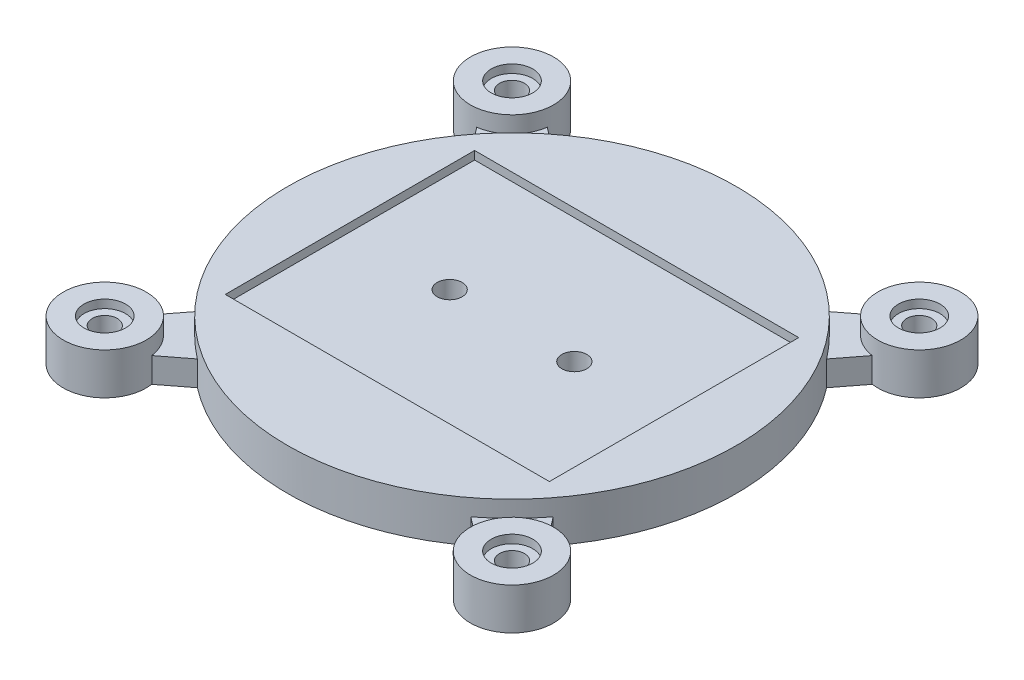
ISO-10303-21;
HEADER;
FILE_DESCRIPTION(('STEP AP214'),'2;1');
FILE_NAME('part.step','',(''),(''),'','','');
FILE_SCHEMA(('AUTOMOTIVE_DESIGN { 1 0 10303 214 1 1 1 1 }'));
ENDSEC;
DATA;
#1=APPLICATION_CONTEXT('core data for automotive mechanical design processes');
#2=APPLICATION_PROTOCOL_DEFINITION('international standard','automotive_design',2000,#1);
#3=PRODUCT_CONTEXT('',#1,'mechanical');
#4=PRODUCT('Part','Part','',(#3));
#5=PRODUCT_RELATED_PRODUCT_CATEGORY('part','',(#4));
#6=PRODUCT_DEFINITION_FORMATION('','',#4);
#7=PRODUCT_DEFINITION_CONTEXT('part definition',#1,'design');
#8=PRODUCT_DEFINITION('design','',#6,#7);
#9=PRODUCT_DEFINITION_SHAPE('','',#8);
#10=(LENGTH_UNIT() NAMED_UNIT(*) SI_UNIT(.MILLI.,.METRE.));
#11=(NAMED_UNIT(*) PLANE_ANGLE_UNIT() SI_UNIT($,.RADIAN.));
#12=(NAMED_UNIT(*) SI_UNIT($,.STERADIAN.) SOLID_ANGLE_UNIT());
#13=UNCERTAINTY_MEASURE_WITH_UNIT(LENGTH_MEASURE(1.E-05),#10,'distance_accuracy_value','');
#14=(GEOMETRIC_REPRESENTATION_CONTEXT(3) GLOBAL_UNCERTAINTY_ASSIGNED_CONTEXT((#13)) GLOBAL_UNIT_ASSIGNED_CONTEXT((#10,
#11,#12)) REPRESENTATION_CONTEXT('',''));
#15=CARTESIAN_POINT('',(0.,0.,0.));
#16=DIRECTION('',(0.,0.,1.));
#17=DIRECTION('',(1.,0.,0.));
#18=AXIS2_PLACEMENT_3D('',#15,#16,#17);
#19=CARTESIAN_POINT('',(0.,5.,0.));
#20=DIRECTION('',(0.,-1.,0.));
#21=DIRECTION('',(0.,0.,-1.));
#22=AXIS2_PLACEMENT_3D('',#19,#20,#21);
#23=CYLINDRICAL_SURFACE('',#22,27.);
#24=CARTESIAN_POINT('',(0.,5.,0.));
#25=DIRECTION('',(0.,1.,0.));
#26=DIRECTION('',(0.,0.,1.));
#27=AXIS2_PLACEMENT_3D('',#24,#25,#26);
#28=CIRCLE('',#27,27.);
#29=CARTESIAN_POINT('',(0.,5.,27.));
#30=VERTEX_POINT('',#29);
#31=EDGE_CURVE('E11',#30,#30,#28,.T.);
#32=ORIENTED_EDGE('',*,*,#31,.F.);
#33=EDGE_LOOP('',(#32));
#34=FACE_BOUND('',#33,.T.);
#35=CARTESIAN_POINT('',(0.,0.,0.));
#36=DIRECTION('',(0.,1.,0.));
#37=DIRECTION('',(0.,0.,1.));
#38=AXIS2_PLACEMENT_3D('',#35,#36,#37);
#39=CIRCLE('',#38,27.);
#40=CARTESIAN_POINT('',(21.4056687517955,0.,16.4559212834895));
#41=VERTEX_POINT('',#40);
#42=CARTESIAN_POINT('',(21.4056687517952,0.,-16.45592128349));
#43=VERTEX_POINT('',#42);
#44=EDGE_CURVE('E420',#41,#43,#39,.T.);
#45=ORIENTED_EDGE('',*,*,#44,.T.);
#46=DIRECTION('',(0.,-1.,0.));
#47=VECTOR('',#46,1.);
#48=CARTESIAN_POINT('',(21.4056687517952,3.,-16.45592128349));
#49=LINE('',#48,#47);
#50=CARTESIAN_POINT('',(21.4056687517952,3.,-16.45592128349));
#51=VERTEX_POINT('',#50);
#52=EDGE_CURVE('E61',#51,#43,#49,.T.);
#53=ORIENTED_EDGE('',*,*,#52,.F.);
#54=CARTESIAN_POINT('',(0.,3.,0.));
#55=DIRECTION('',(0.,1.,0.));
#56=DIRECTION('',(-1.,0.,0.));
#57=AXIS2_PLACEMENT_3D('',#54,#55,#56);
#58=CIRCLE('',#57,27.);
#59=CARTESIAN_POINT('',(16.4559212834893,3.,-21.4056687517957));
#60=VERTEX_POINT('',#59);
#61=EDGE_CURVE('E56',#51,#60,#58,.T.);
#62=ORIENTED_EDGE('',*,*,#61,.T.);
#63=DIRECTION('',(0.,-1.,0.));
#64=VECTOR('',#63,1.);
#65=CARTESIAN_POINT('',(16.4559212834893,3.,-21.4056687517957));
#66=LINE('',#65,#64);
#67=CARTESIAN_POINT('',(16.4559212834893,0.,-21.4056687517957));
#68=VERTEX_POINT('',#67);
#69=EDGE_CURVE('E203',#60,#68,#66,.T.);
#70=ORIENTED_EDGE('',*,*,#69,.T.);
#71=CARTESIAN_POINT('',(-16.4559212834898,0.,-21.4056687517954));
#72=VERTEX_POINT('',#71);
#73=EDGE_CURVE('E417',#68,#72,#39,.T.);
#74=ORIENTED_EDGE('',*,*,#73,.T.);
#75=DIRECTION('',(0.,-1.,0.));
#76=VECTOR('',#75,1.);
#77=CARTESIAN_POINT('',(-16.4559212834898,3.,-21.4056687517954));
#78=LINE('',#77,#76);
#79=CARTESIAN_POINT('',(-16.4559212834898,3.,-21.4056687517954));
#80=VERTEX_POINT('',#79);
#81=EDGE_CURVE('E414',#80,#72,#78,.T.);
#82=ORIENTED_EDGE('',*,*,#81,.F.);
#83=CARTESIAN_POINT('',(0.,3.,0.));
#84=DIRECTION('',(0.,1.,0.));
#85=DIRECTION('',(0.,0.,1.));
#86=AXIS2_PLACEMENT_3D('',#83,#84,#85);
#87=CIRCLE('',#86,27.);
#88=CARTESIAN_POINT('',(-21.4056687517956,3.,-16.4559212834895));
#89=VERTEX_POINT('',#88);
#90=EDGE_CURVE('E381',#80,#89,#87,.T.);
#91=ORIENTED_EDGE('',*,*,#90,.T.);
#92=DIRECTION('',(0.,-1.,0.));
#93=VECTOR('',#92,1.);
#94=CARTESIAN_POINT('',(-21.4056687517955,3.,-16.4559212834895));
#95=LINE('',#94,#93);
#96=CARTESIAN_POINT('',(-21.4056687517955,0.,-16.4559212834895));
#97=VERTEX_POINT('',#96);
#98=EDGE_CURVE('E397',#89,#97,#95,.T.);
#99=ORIENTED_EDGE('',*,*,#98,.T.);
#100=CARTESIAN_POINT('',(-21.4056687517953,0.,16.4559212834898));
#101=VERTEX_POINT('',#100);
#102=EDGE_CURVE('E44',#97,#101,#39,.T.);
#103=ORIENTED_EDGE('',*,*,#102,.T.);
#104=DIRECTION('',(0.,-1.,0.));
#105=VECTOR('',#104,1.);
#106=CARTESIAN_POINT('',(-21.4056687517953,3.,16.4559212834898));
#107=LINE('',#106,#105);
#108=CARTESIAN_POINT('',(-21.4056687517953,3.,16.4559212834898));
#109=VERTEX_POINT('',#108);
#110=EDGE_CURVE('E292',#109,#101,#107,.T.);
#111=ORIENTED_EDGE('',*,*,#110,.F.);
#112=CARTESIAN_POINT('',(0.,3.,0.));
#113=DIRECTION('',(0.,1.,0.));
#114=DIRECTION('',(1.,0.,0.));
#115=AXIS2_PLACEMENT_3D('',#112,#113,#114);
#116=CIRCLE('',#115,27.);
#117=CARTESIAN_POINT('',(-16.4559212834894,3.,21.4056687517956));
#118=VERTEX_POINT('',#117);
#119=EDGE_CURVE('E259',#109,#118,#116,.T.);
#120=ORIENTED_EDGE('',*,*,#119,.T.);
#121=DIRECTION('',(0.,-1.,0.));
#122=VECTOR('',#121,1.);
#123=CARTESIAN_POINT('',(-16.4559212834894,3.,21.4056687517956));
#124=LINE('',#123,#122);
#125=CARTESIAN_POINT('',(-16.4559212834894,0.,21.4056687517956));
#126=VERTEX_POINT('',#125);
#127=EDGE_CURVE('E275',#118,#126,#124,.T.);
#128=ORIENTED_EDGE('',*,*,#127,.T.);
#129=CARTESIAN_POINT('',(16.4559212834898,0.,21.4056687517954));
#130=VERTEX_POINT('',#129);
#131=EDGE_CURVE('E422',#126,#130,#39,.T.);
#132=ORIENTED_EDGE('',*,*,#131,.T.);
#133=DIRECTION('',(0.,-1.,0.));
#134=VECTOR('',#133,1.);
#135=CARTESIAN_POINT('',(16.4559212834898,3.,21.4056687517954));
#136=LINE('',#135,#134);
#137=CARTESIAN_POINT('',(16.4559212834898,3.,21.4056687517954));
#138=VERTEX_POINT('',#137);
#139=EDGE_CURVE('E254',#138,#130,#136,.T.);
#140=ORIENTED_EDGE('',*,*,#139,.F.);
#141=CARTESIAN_POINT('',(0.,3.,0.));
#142=DIRECTION('',(0.,1.,0.));
#143=DIRECTION('',(0.,0.,-1.));
#144=AXIS2_PLACEMENT_3D('',#141,#142,#143);
#145=CIRCLE('',#144,27.);
#146=CARTESIAN_POINT('',(21.4056687517956,3.,16.4559212834895));
#147=VERTEX_POINT('',#146);
#148=EDGE_CURVE('E221',#138,#147,#145,.T.);
#149=ORIENTED_EDGE('',*,*,#148,.T.);
#150=DIRECTION('',(0.,-1.,0.));
#151=VECTOR('',#150,1.);
#152=CARTESIAN_POINT('',(21.4056687517955,3.,16.4559212834895));
#153=LINE('',#152,#151);
#154=EDGE_CURVE('E237',#147,#41,#153,.T.);
#155=ORIENTED_EDGE('',*,*,#154,.T.);
#156=EDGE_LOOP('',(#45,#53,#62,#70,#74,#82,#91,#99,#103,#111,#120,#128,#132,#140,#149,#155));
#157=FACE_BOUND('',#156,.T.);
#158=ADVANCED_FACE('F41',(#34,#157),#23,.T.);
#159=CARTESIAN_POINT('',(0.,5.,0.));
#160=DIRECTION('',(0.,1.,0.));
#161=DIRECTION('',(0.,0.,1.));
#162=AXIS2_PLACEMENT_3D('',#159,#160,#161);
#163=PLANE('',#162);
#164=DIRECTION('',(0.,0.,-1.));
#165=VECTOR('',#164,1.);
#166=CARTESIAN_POINT('',(19.5,5.,15.));
#167=LINE('',#166,#165);
#168=CARTESIAN_POINT('',(19.5,5.,15.));
#169=VERTEX_POINT('',#168);
#170=CARTESIAN_POINT('',(19.5,5.,-15.));
#171=VERTEX_POINT('',#170);
#172=EDGE_CURVE('E301',#169,#171,#167,.T.);
#173=ORIENTED_EDGE('',*,*,#172,.F.);
#174=DIRECTION('',(1.,0.,0.));
#175=VECTOR('',#174,1.);
#176=CARTESIAN_POINT('',(-19.5,5.,15.));
#177=LINE('',#176,#175);
#178=CARTESIAN_POINT('',(-19.5,5.,15.));
#179=VERTEX_POINT('',#178);
#180=EDGE_CURVE('E318',#179,#169,#177,.T.);
#181=ORIENTED_EDGE('',*,*,#180,.F.);
#182=DIRECTION('',(0.,0.,1.));
#183=VECTOR('',#182,1.);
#184=CARTESIAN_POINT('',(-19.5,5.,15.));
#185=LINE('',#184,#183);
#186=CARTESIAN_POINT('',(-19.5,5.,-15.));
#187=VERTEX_POINT('',#186);
#188=EDGE_CURVE('E337',#187,#179,#185,.T.);
#189=ORIENTED_EDGE('',*,*,#188,.F.);
#190=DIRECTION('',(-1.,0.,0.));
#191=VECTOR('',#190,1.);
#192=CARTESIAN_POINT('',(-19.5,5.,-15.));
#193=LINE('',#192,#191);
#194=EDGE_CURVE('E333',#171,#187,#193,.T.);
#195=ORIENTED_EDGE('',*,*,#194,.F.);
#196=EDGE_LOOP('',(#173,#181,#189,#195));
#197=FACE_BOUND('',#196,.T.);
#198=ORIENTED_EDGE('',*,*,#31,.T.);
#199=EDGE_LOOP('',(#198));
#200=FACE_BOUND('',#199,.T.);
#201=ADVANCED_FACE('F485',(#197,#200),#163,.T.);
#202=CARTESIAN_POINT('',(0.,0.,0.));
#203=DIRECTION('',(0.,1.,0.));
#204=DIRECTION('',(0.,0.,1.));
#205=AXIS2_PLACEMENT_3D('',#202,#203,#204);
#206=PLANE('',#205);
#207=CARTESIAN_POINT('',(24.4999999999995,0.,-24.5000000000003));
#208=DIRECTION('',(0.,1.,0.));
#209=DIRECTION('',(0.,0.,1.));
#210=AXIS2_PLACEMENT_3D('',#207,#208,#209);
#211=CIRCLE('',#210,1.5);
#212=CARTESIAN_POINT('',(24.4999999999995,0.,-23.0000000000003));
#213=VERTEX_POINT('',#212);
#214=EDGE_CURVE('E837',#213,#213,#211,.T.);
#215=ORIENTED_EDGE('',*,*,#214,.T.);
#216=EDGE_LOOP('',(#215));
#217=FACE_BOUND('',#216,.T.);
#218=CARTESIAN_POINT('',(24.5,0.,24.4999999999997));
#219=DIRECTION('',(0.,1.,0.));
#220=DIRECTION('',(0.,0.,1.));
#221=AXIS2_PLACEMENT_3D('',#218,#219,#220);
#222=CIRCLE('',#221,1.5);
#223=CARTESIAN_POINT('',(24.5,0.,25.9999999999997));
#224=VERTEX_POINT('',#223);
#225=EDGE_CURVE('E853',#224,#224,#222,.T.);
#226=ORIENTED_EDGE('',*,*,#225,.T.);
#227=EDGE_LOOP('',(#226));
#228=FACE_BOUND('',#227,.T.);
#229=CARTESIAN_POINT('',(-24.4999999999996,0.,24.5000000000001));
#230=DIRECTION('',(0.,1.,0.));
#231=DIRECTION('',(0.,0.,1.));
#232=AXIS2_PLACEMENT_3D('',#229,#230,#231);
#233=CIRCLE('',#232,1.5);
#234=CARTESIAN_POINT('',(-24.4999999999996,0.,26.0000000000001));
#235=VERTEX_POINT('',#234);
#236=EDGE_CURVE('E869',#235,#235,#233,.T.);
#237=ORIENTED_EDGE('',*,*,#236,.T.);
#238=EDGE_LOOP('',(#237));
#239=FACE_BOUND('',#238,.T.);
#240=CARTESIAN_POINT('',(-7.5,0.,0.));
#241=DIRECTION('',(0.,1.,0.));
#242=DIRECTION('',(0.,0.,1.));
#243=AXIS2_PLACEMENT_3D('',#240,#241,#242);
#244=CIRCLE('',#243,1.5);
#245=CARTESIAN_POINT('',(-7.5,0.,1.5));
#246=VERTEX_POINT('',#245);
#247=EDGE_CURVE('E297',#246,#246,#244,.T.);
#248=ORIENTED_EDGE('',*,*,#247,.T.);
#249=EDGE_LOOP('',(#248));
#250=FACE_BOUND('',#249,.T.);
#251=CARTESIAN_POINT('',(7.5,0.,0.));
#252=DIRECTION('',(0.,1.,0.));
#253=DIRECTION('',(0.,0.,-1.));
#254=AXIS2_PLACEMENT_3D('',#251,#252,#253);
#255=CIRCLE('',#254,1.5);
#256=CARTESIAN_POINT('',(7.5,0.,-1.5));
#257=VERTEX_POINT('',#256);
#258=EDGE_CURVE('E306',#257,#257,#255,.T.);
#259=ORIENTED_EDGE('',*,*,#258,.T.);
#260=EDGE_LOOP('',(#259));
#261=FACE_BOUND('',#260,.T.);
#262=CARTESIAN_POINT('',(-24.5,0.,-24.4999999999997));
#263=DIRECTION('',(0.,1.,0.));
#264=DIRECTION('',(0.,0.,1.));
#265=AXIS2_PLACEMENT_3D('',#262,#263,#264);
#266=CIRCLE('',#265,1.5);
#267=CARTESIAN_POINT('',(-24.5,0.,-22.9999999999997));
#268=VERTEX_POINT('',#267);
#269=EDGE_CURVE('E368',#268,#268,#266,.T.);
#270=ORIENTED_EDGE('',*,*,#269,.T.);
#271=EDGE_LOOP('',(#270));
#272=FACE_BOUND('',#271,.T.);
#273=ORIENTED_EDGE('',*,*,#102,.F.);
#274=DIRECTION('',(0.610830552899988,0.,0.791761350183182));
#275=VECTOR('',#274,1.);
#276=CARTESIAN_POINT('',(-5.46030431856545,0.,4.21253286124648));
#277=LINE('',#276,#275);
#278=CARTESIAN_POINT('',(-23.7928932188134,0.,-19.5502525316939));
#279=VERTEX_POINT('',#278);
#280=EDGE_CURVE('E385',#279,#97,#277,.T.);
#281=ORIENTED_EDGE('',*,*,#280,.F.);
#282=CARTESIAN_POINT('',(-24.5,0.,-24.4999999999997));
#283=DIRECTION('',(0.,1.,0.));
#284=DIRECTION('',(0.,0.,1.));
#285=AXIS2_PLACEMENT_3D('',#282,#283,#284);
#286=CIRCLE('',#285,4.99999999999999);
#287=CARTESIAN_POINT('',(-19.5502525316942,0.,-23.7928932188132));
#288=VERTEX_POINT('',#287);
#289=EDGE_CURVE('E372',#288,#279,#286,.T.);
#290=ORIENTED_EDGE('',*,*,#289,.F.);
#291=DIRECTION('',(0.791761350183189,0.,0.610830552899979));
#292=VECTOR('',#291,1.);
#293=CARTESIAN_POINT('',(4.21253286124642,0.,-5.46030431856551));
#294=LINE('',#293,#292);
#295=EDGE_CURVE('E377',#288,#72,#294,.T.);
#296=ORIENTED_EDGE('',*,*,#295,.T.);
#297=ORIENTED_EDGE('',*,*,#73,.F.);
#298=DIRECTION('',(-0.791761350183175,0.,0.610830552899997));
#299=VECTOR('',#298,1.);
#300=CARTESIAN_POINT('',(-4.21253286124653,0.,-5.46030431856541));
#301=LINE('',#300,#299);
#302=CARTESIAN_POINT('',(19.5502525316937,0.,-23.7928932188136));
#303=VERTEX_POINT('',#302);
#304=EDGE_CURVE('E209',#303,#68,#301,.T.);
#305=ORIENTED_EDGE('',*,*,#304,.F.);
#306=CARTESIAN_POINT('',(24.4999999999995,0.,-24.5000000000003));
#307=DIRECTION('',(0.,1.,0.));
#308=DIRECTION('',(-1.,0.,0.));
#309=AXIS2_PLACEMENT_3D('',#306,#307,#308);
#310=CIRCLE('',#309,4.99999999999999);
#311=CARTESIAN_POINT('',(23.792893218813,0.,-19.5502525316944));
#312=VERTEX_POINT('',#311);
#313=EDGE_CURVE('E449',#312,#303,#310,.T.);
#314=ORIENTED_EDGE('',*,*,#313,.F.);
#315=DIRECTION('',(-0.610830552899971,0.,0.791761350183195));
#316=VECTOR('',#315,1.);
#317=CARTESIAN_POINT('',(5.46030431856555,0.,4.21253286124636));
#318=LINE('',#317,#316);
#319=EDGE_CURVE('E190',#312,#43,#318,.T.);
#320=ORIENTED_EDGE('',*,*,#319,.T.);
#321=ORIENTED_EDGE('',*,*,#44,.F.);
#322=DIRECTION('',(-0.610830552899988,0.,-0.791761350183182));
#323=VECTOR('',#322,1.);
#324=CARTESIAN_POINT('',(5.46030431856545,0.,-4.21253286124648));
#325=LINE('',#324,#323);
#326=CARTESIAN_POINT('',(23.7928932188134,0.,19.5502525316939));
#327=VERTEX_POINT('',#326);
#328=EDGE_CURVE('E225',#327,#41,#325,.T.);
#329=ORIENTED_EDGE('',*,*,#328,.F.);
#330=CARTESIAN_POINT('',(24.5,0.,24.4999999999997));
#331=DIRECTION('',(0.,1.,0.));
#332=DIRECTION('',(0.,0.,-1.));
#333=AXIS2_PLACEMENT_3D('',#330,#331,#332);
#334=CIRCLE('',#333,4.99999999999999);
#335=CARTESIAN_POINT('',(19.5502525316942,0.,23.7928932188132));
#336=VERTEX_POINT('',#335);
#337=EDGE_CURVE('E436',#336,#327,#334,.T.);
#338=ORIENTED_EDGE('',*,*,#337,.F.);
#339=DIRECTION('',(-0.791761350183189,0.,-0.610830552899979));
#340=VECTOR('',#339,1.);
#341=CARTESIAN_POINT('',(-4.21253286124642,0.,5.46030431856551));
#342=LINE('',#341,#340);
#343=EDGE_CURVE('E220',#336,#130,#342,.T.);
#344=ORIENTED_EDGE('',*,*,#343,.T.);
#345=ORIENTED_EDGE('',*,*,#131,.F.);
#346=DIRECTION('',(0.791761350183179,0.,-0.610830552899991));
#347=VECTOR('',#346,1.);
#348=CARTESIAN_POINT('',(4.21253286124649,0.,5.46030431856544));
#349=LINE('',#348,#347);
#350=CARTESIAN_POINT('',(-19.5502525316938,0.,23.7928932188135));
#351=VERTEX_POINT('',#350);
#352=EDGE_CURVE('E263',#351,#126,#349,.T.);
#353=ORIENTED_EDGE('',*,*,#352,.F.);
#354=CARTESIAN_POINT('',(-24.4999999999996,0.,24.5000000000001));
#355=DIRECTION('',(0.,1.,0.));
#356=DIRECTION('',(1.,0.,0.));
#357=AXIS2_PLACEMENT_3D('',#354,#355,#356);
#358=CIRCLE('',#357,4.99999999999999);
#359=CARTESIAN_POINT('',(-23.7928932188131,0.,19.5502525316942));
#360=VERTEX_POINT('',#359);
#361=EDGE_CURVE('E446',#360,#351,#358,.T.);
#362=ORIENTED_EDGE('',*,*,#361,.F.);
#363=DIRECTION('',(0.610830552899977,0.,-0.791761350183191));
#364=VECTOR('',#363,1.);
#365=CARTESIAN_POINT('',(-5.46030431856552,0.,-4.2125328612464));
#366=LINE('',#365,#364);
#367=EDGE_CURVE('E258',#360,#101,#366,.T.);
#368=ORIENTED_EDGE('',*,*,#367,.T.);
#369=EDGE_LOOP('',(#273,#281,#290,#296,#297,#305,#314,#320,#321,#329,#338,#344,#345,#353,#362,#368));
#370=FACE_BOUND('',#369,.T.);
#371=ADVANCED_FACE('F433',(#217,#228,#239,#250,#261,#272,#370),#206,.F.);
#372=CARTESIAN_POINT('',(4.21253286124642,3.,-5.46030431856551));
#373=DIRECTION('',(0.610830552899979,0.,-0.791761350183188));
#374=DIRECTION('',(-0.791761350183188,0.,-0.610830552899979));
#375=AXIS2_PLACEMENT_3D('',#372,#373,#374);
#376=PLANE('',#375);
#377=ORIENTED_EDGE('',*,*,#295,.F.);
#378=DIRECTION('',(0.,-1.,0.));
#379=VECTOR('',#378,1.);
#380=CARTESIAN_POINT('',(-19.5502525316942,3.,-23.7928932188132));
#381=LINE('',#380,#379);
#382=CARTESIAN_POINT('',(-19.5502525316942,3.,-23.7928932188132));
#383=VERTEX_POINT('',#382);
#384=EDGE_CURVE('E410',#383,#288,#381,.T.);
#385=ORIENTED_EDGE('',*,*,#384,.F.);
#386=DIRECTION('',(0.791761350183189,0.,0.610830552899979));
#387=VECTOR('',#386,1.);
#388=CARTESIAN_POINT('',(4.21253286124642,3.,-5.46030431856551));
#389=LINE('',#388,#387);
#390=EDGE_CURVE('E384',#383,#80,#389,.T.);
#391=ORIENTED_EDGE('',*,*,#390,.T.);
#392=ORIENTED_EDGE('',*,*,#81,.T.);
#393=EDGE_LOOP('',(#377,#385,#391,#392));
#394=FACE_BOUND('',#393,.T.);
#395=ADVANCED_FACE('F497',(#394),#376,.T.);
#396=CARTESIAN_POINT('',(-5.46030431856545,3.,4.21253286124648));
#397=DIRECTION('',(0.791761350183181,0.,-0.610830552899988));
#398=DIRECTION('',(-0.610830552899988,0.,-0.791761350183182));
#399=AXIS2_PLACEMENT_3D('',#396,#397,#398);
#400=PLANE('',#399);
#401=ORIENTED_EDGE('',*,*,#280,.T.);
#402=ORIENTED_EDGE('',*,*,#98,.F.);
#403=DIRECTION('',(0.610830552899988,0.,0.791761350183182));
#404=VECTOR('',#403,1.);
#405=CARTESIAN_POINT('',(-5.46030431856545,3.,4.21253286124648));
#406=LINE('',#405,#404);
#407=CARTESIAN_POINT('',(-23.7928932188134,3.,-19.5502525316939));
#408=VERTEX_POINT('',#407);
#409=EDGE_CURVE('E393',#408,#89,#406,.T.);
#410=ORIENTED_EDGE('',*,*,#409,.F.);
#411=DIRECTION('',(0.,-1.,0.));
#412=VECTOR('',#411,1.);
#413=CARTESIAN_POINT('',(-23.7928932188134,3.,-19.5502525316939));
#414=LINE('',#413,#412);
#415=EDGE_CURVE('E407',#408,#279,#414,.T.);
#416=ORIENTED_EDGE('',*,*,#415,.T.);
#417=EDGE_LOOP('',(#401,#402,#410,#416));
#418=FACE_BOUND('',#417,.T.);
#419=ADVANCED_FACE('F503',(#418),#400,.F.);
#420=CARTESIAN_POINT('',(0.,3.,0.));
#421=DIRECTION('',(0.,1.,0.));
#422=DIRECTION('',(0.,0.,1.));
#423=AXIS2_PLACEMENT_3D('',#420,#421,#422);
#424=PLANE('',#423);
#425=ORIENTED_EDGE('',*,*,#90,.F.);
#426=ORIENTED_EDGE('',*,*,#390,.F.);
#427=CARTESIAN_POINT('',(-24.5,3.,-24.4999999999997));
#428=DIRECTION('',(0.,1.,0.));
#429=DIRECTION('',(0.,0.,1.));
#430=AXIS2_PLACEMENT_3D('',#427,#428,#429);
#431=CIRCLE('',#430,4.99999999999999);
#432=EDGE_CURVE('E389',#408,#383,#431,.T.);
#433=ORIENTED_EDGE('',*,*,#432,.F.);
#434=ORIENTED_EDGE('',*,*,#409,.T.);
#435=EDGE_LOOP('',(#425,#426,#433,#434));
#436=FACE_BOUND('',#435,.T.);
#437=ADVANCED_FACE('F506',(#436),#424,.T.);
#438=CARTESIAN_POINT('',(-24.5,5.,-24.4999999999997));
#439=DIRECTION('',(0.,-1.,0.));
#440=DIRECTION('',(0.,0.,-1.));
#441=AXIS2_PLACEMENT_3D('',#438,#439,#440);
#442=CYLINDRICAL_SURFACE('',#441,4.99999999999999);
#443=ORIENTED_EDGE('',*,*,#384,.T.);
#444=ORIENTED_EDGE('',*,*,#289,.T.);
#445=ORIENTED_EDGE('',*,*,#415,.F.);
#446=ORIENTED_EDGE('',*,*,#432,.T.);
#447=EDGE_LOOP('',(#443,#444,#445,#446));
#448=FACE_BOUND('',#447,.T.);
#449=CARTESIAN_POINT('',(-24.5,5.,-24.4999999999997));
#450=DIRECTION('',(0.,1.,0.));
#451=DIRECTION('',(0.,0.,1.));
#452=AXIS2_PLACEMENT_3D('',#449,#450,#451);
#453=CIRCLE('',#452,4.99999999999999);
#454=CARTESIAN_POINT('',(-24.5,5.,-19.4999999999997));
#455=VERTEX_POINT('',#454);
#456=EDGE_CURVE('E373',#455,#455,#453,.T.);
#457=ORIENTED_EDGE('',*,*,#456,.F.);
#458=EDGE_LOOP('',(#457));
#459=FACE_BOUND('',#458,.T.);
#460=ADVANCED_FACE('F510',(#448,#459),#442,.T.);
#461=CARTESIAN_POINT('',(0.,5.,0.));
#462=DIRECTION('',(0.,1.,0.));
#463=DIRECTION('',(0.,0.,1.));
#464=AXIS2_PLACEMENT_3D('',#461,#462,#463);
#465=PLANE('',#464);
#466=CARTESIAN_POINT('',(-24.5,5.,-24.4999999999997));
#467=DIRECTION('',(0.,1.,0.));
#468=DIRECTION('',(0.,0.,1.));
#469=AXIS2_PLACEMENT_3D('',#466,#467,#468);
#470=CIRCLE('',#469,2.5);
#471=CARTESIAN_POINT('',(-24.5,5.,-21.9999999999997));
#472=VERTEX_POINT('',#471);
#473=EDGE_CURVE('E347',#472,#472,#470,.T.);
#474=ORIENTED_EDGE('',*,*,#473,.F.);
#475=EDGE_LOOP('',(#474));
#476=FACE_BOUND('',#475,.T.);
#477=ORIENTED_EDGE('',*,*,#456,.T.);
#478=EDGE_LOOP('',(#477));
#479=FACE_BOUND('',#478,.T.);
#480=ADVANCED_FACE('F514',(#476,#479),#465,.T.);
#481=CARTESIAN_POINT('',(-24.5,5.,-24.4999999999997));
#482=DIRECTION('',(0.,1.,0.));
#483=DIRECTION('',(0.,0.,1.));
#484=AXIS2_PLACEMENT_3D('',#481,#482,#483);
#485=CYLINDRICAL_SURFACE('',#484,1.5);
#486=ORIENTED_EDGE('',*,*,#269,.F.);
#487=EDGE_LOOP('',(#486));
#488=FACE_BOUND('',#487,.T.);
#489=CARTESIAN_POINT('',(-24.5,4.,-24.4999999999997));
#490=DIRECTION('',(0.,1.,0.));
#491=DIRECTION('',(0.,0.,1.));
#492=AXIS2_PLACEMENT_3D('',#489,#490,#491);
#493=CIRCLE('',#492,1.5);
#494=CARTESIAN_POINT('',(-24.5,4.,-22.9999999999997));
#495=VERTEX_POINT('',#494);
#496=EDGE_CURVE('E364',#495,#495,#493,.T.);
#497=ORIENTED_EDGE('',*,*,#496,.T.);
#498=EDGE_LOOP('',(#497));
#499=FACE_BOUND('',#498,.T.);
#500=ADVANCED_FACE('F518',(#488,#499),#485,.F.);
#501=CARTESIAN_POINT('',(-23.,4.,-24.4999999999997));
#502=DIRECTION('',(0.,-1.,0.));
#503=DIRECTION('',(0.,0.,-1.));
#504=AXIS2_PLACEMENT_3D('',#501,#502,#503);
#505=PLANE('',#504);
#506=ORIENTED_EDGE('',*,*,#496,.F.);
#507=EDGE_LOOP('',(#506));
#508=FACE_BOUND('',#507,.T.);
#509=CARTESIAN_POINT('',(-24.5,4.,-24.4999999999997));
#510=DIRECTION('',(0.,1.,0.));
#511=DIRECTION('',(0.,0.,1.));
#512=AXIS2_PLACEMENT_3D('',#509,#510,#511);
#513=CIRCLE('',#512,2.5);
#514=CARTESIAN_POINT('',(-24.5,4.,-21.9999999999997));
#515=VERTEX_POINT('',#514);
#516=EDGE_CURVE('E360',#515,#515,#513,.T.);
#517=ORIENTED_EDGE('',*,*,#516,.T.);
#518=EDGE_LOOP('',(#517));
#519=FACE_BOUND('',#518,.T.);
#520=ADVANCED_FACE('F522',(#508,#519),#505,.F.);
#521=CARTESIAN_POINT('',(-24.5,5.,-24.4999999999997));
#522=DIRECTION('',(0.,1.,0.));
#523=DIRECTION('',(0.,0.,1.));
#524=AXIS2_PLACEMENT_3D('',#521,#522,#523);
#525=CYLINDRICAL_SURFACE('',#524,2.5);
#526=ORIENTED_EDGE('',*,*,#516,.F.);
#527=EDGE_LOOP('',(#526));
#528=FACE_BOUND('',#527,.T.);
#529=ORIENTED_EDGE('',*,*,#473,.T.);
#530=EDGE_LOOP('',(#529));
#531=FACE_BOUND('',#530,.T.);
#532=ADVANCED_FACE('F526',(#528,#531),#525,.F.);
#533=CARTESIAN_POINT('',(19.5,4.,15.));
#534=DIRECTION('',(1.,0.,0.));
#535=DIRECTION('',(0.,0.,-1.));
#536=AXIS2_PLACEMENT_3D('',#533,#534,#535);
#537=PLANE('',#536);
#538=ORIENTED_EDGE('',*,*,#172,.T.);
#539=DIRECTION('',(0.,1.,0.));
#540=VECTOR('',#539,1.);
#541=CARTESIAN_POINT('',(19.5,4.,-15.));
#542=LINE('',#541,#540);
#543=CARTESIAN_POINT('',(19.5,4.,-15.));
#544=VERTEX_POINT('',#543);
#545=EDGE_CURVE('E330',#544,#171,#542,.T.);
#546=ORIENTED_EDGE('',*,*,#545,.F.);
#547=DIRECTION('',(0.,0.,-1.));
#548=VECTOR('',#547,1.);
#549=CARTESIAN_POINT('',(19.5,4.,15.));
#550=LINE('',#549,#548);
#551=CARTESIAN_POINT('',(19.5,4.,15.));
#552=VERTEX_POINT('',#551);
#553=EDGE_CURVE('E313',#552,#544,#550,.T.);
#554=ORIENTED_EDGE('',*,*,#553,.F.);
#555=DIRECTION('',(0.,1.,0.));
#556=VECTOR('',#555,1.);
#557=CARTESIAN_POINT('',(19.5,4.,15.));
#558=LINE('',#557,#556);
#559=EDGE_CURVE('E344',#552,#169,#558,.T.);
#560=ORIENTED_EDGE('',*,*,#559,.T.);
#561=EDGE_LOOP('',(#538,#546,#554,#560));
#562=FACE_BOUND('',#561,.T.);
#563=ADVANCED_FACE('F530',(#562),#537,.F.);
#564=CARTESIAN_POINT('',(-19.5,4.,15.));
#565=DIRECTION('',(0.,0.,1.));
#566=DIRECTION('',(1.,0.,0.));
#567=AXIS2_PLACEMENT_3D('',#564,#565,#566);
#568=PLANE('',#567);
#569=ORIENTED_EDGE('',*,*,#180,.T.);
#570=ORIENTED_EDGE('',*,*,#559,.F.);
#571=DIRECTION('',(1.,0.,0.));
#572=VECTOR('',#571,1.);
#573=CARTESIAN_POINT('',(-19.5,4.,15.));
#574=LINE('',#573,#572);
#575=CARTESIAN_POINT('',(-19.5,4.,15.));
#576=VERTEX_POINT('',#575);
#577=EDGE_CURVE('E326',#576,#552,#574,.T.);
#578=ORIENTED_EDGE('',*,*,#577,.F.);
#579=DIRECTION('',(0.,1.,0.));
#580=VECTOR('',#579,1.);
#581=CARTESIAN_POINT('',(-19.5,4.,15.));
#582=LINE('',#581,#580);
#583=EDGE_CURVE('E348',#576,#179,#582,.T.);
#584=ORIENTED_EDGE('',*,*,#583,.T.);
#585=EDGE_LOOP('',(#569,#570,#578,#584));
#586=FACE_BOUND('',#585,.T.);
#587=ADVANCED_FACE('F534',(#586),#568,.F.);
#588=CARTESIAN_POINT('',(-19.5,4.,15.));
#589=DIRECTION('',(-1.,0.,0.));
#590=DIRECTION('',(0.,0.,1.));
#591=AXIS2_PLACEMENT_3D('',#588,#589,#590);
#592=PLANE('',#591);
#593=ORIENTED_EDGE('',*,*,#188,.T.);
#594=ORIENTED_EDGE('',*,*,#583,.F.);
#595=DIRECTION('',(0.,0.,1.));
#596=VECTOR('',#595,1.);
#597=CARTESIAN_POINT('',(-19.5,4.,15.));
#598=LINE('',#597,#596);
#599=CARTESIAN_POINT('',(-19.5,4.,-15.));
#600=VERTEX_POINT('',#599);
#601=EDGE_CURVE('E322',#600,#576,#598,.T.);
#602=ORIENTED_EDGE('',*,*,#601,.F.);
#603=DIRECTION('',(0.,1.,0.));
#604=VECTOR('',#603,1.);
#605=CARTESIAN_POINT('',(-19.5,4.,-15.));
#606=LINE('',#605,#604);
#607=EDGE_CURVE('E351',#600,#187,#606,.T.);
#608=ORIENTED_EDGE('',*,*,#607,.T.);
#609=EDGE_LOOP('',(#593,#594,#602,#608));
#610=FACE_BOUND('',#609,.T.);
#611=ADVANCED_FACE('F540',(#610),#592,.F.);
#612=CARTESIAN_POINT('',(-19.5,4.,-15.));
#613=DIRECTION('',(0.,0.,-1.));
#614=DIRECTION('',(-1.,0.,0.));
#615=AXIS2_PLACEMENT_3D('',#612,#613,#614);
#616=PLANE('',#615);
#617=ORIENTED_EDGE('',*,*,#194,.T.);
#618=ORIENTED_EDGE('',*,*,#607,.F.);
#619=DIRECTION('',(-1.,0.,0.));
#620=VECTOR('',#619,1.);
#621=CARTESIAN_POINT('',(-19.5,4.,-15.));
#622=LINE('',#621,#620);
#623=EDGE_CURVE('E317',#544,#600,#622,.T.);
#624=ORIENTED_EDGE('',*,*,#623,.F.);
#625=ORIENTED_EDGE('',*,*,#545,.T.);
#626=EDGE_LOOP('',(#617,#618,#624,#625));
#627=FACE_BOUND('',#626,.T.);
#628=ADVANCED_FACE('F536',(#627),#616,.F.);
#629=CARTESIAN_POINT('',(0.,4.,0.));
#630=DIRECTION('',(0.,-1.,0.));
#631=DIRECTION('',(0.,0.,-1.));
#632=AXIS2_PLACEMENT_3D('',#629,#630,#631);
#633=PLANE('',#632);
#634=CARTESIAN_POINT('',(-7.5,4.,0.));
#635=DIRECTION('',(0.,1.,0.));
#636=DIRECTION('',(0.,0.,1.));
#637=AXIS2_PLACEMENT_3D('',#634,#635,#636);
#638=CIRCLE('',#637,1.5);
#639=CARTESIAN_POINT('',(-7.5,4.,1.5));
#640=VERTEX_POINT('',#639);
#641=EDGE_CURVE('E302',#640,#640,#638,.T.);
#642=ORIENTED_EDGE('',*,*,#641,.F.);
#643=EDGE_LOOP('',(#642));
#644=FACE_BOUND('',#643,.T.);
#645=CARTESIAN_POINT('',(7.5,4.,0.));
#646=DIRECTION('',(0.,1.,0.));
#647=DIRECTION('',(0.,0.,-1.));
#648=AXIS2_PLACEMENT_3D('',#645,#646,#647);
#649=CIRCLE('',#648,1.5);
#650=CARTESIAN_POINT('',(7.5,4.,-1.5));
#651=VERTEX_POINT('',#650);
#652=EDGE_CURVE('E296',#651,#651,#649,.T.);
#653=ORIENTED_EDGE('',*,*,#652,.F.);
#654=EDGE_LOOP('',(#653));
#655=FACE_BOUND('',#654,.T.);
#656=ORIENTED_EDGE('',*,*,#553,.T.);
#657=ORIENTED_EDGE('',*,*,#623,.T.);
#658=ORIENTED_EDGE('',*,*,#601,.T.);
#659=ORIENTED_EDGE('',*,*,#577,.T.);
#660=EDGE_LOOP('',(#656,#657,#658,#659));
#661=FACE_BOUND('',#660,.T.);
#662=ADVANCED_FACE('F539',(#644,#655,#661),#633,.F.);
#663=CARTESIAN_POINT('',(7.5,0.,0.));
#664=DIRECTION('',(0.,1.,0.));
#665=DIRECTION('',(0.,0.,1.));
#666=AXIS2_PLACEMENT_3D('',#663,#664,#665);
#667=CYLINDRICAL_SURFACE('',#666,1.5);
#668=ORIENTED_EDGE('',*,*,#258,.F.);
#669=EDGE_LOOP('',(#668));
#670=FACE_BOUND('',#669,.T.);
#671=ORIENTED_EDGE('',*,*,#652,.T.);
#672=EDGE_LOOP('',(#671));
#673=FACE_BOUND('',#672,.T.);
#674=ADVANCED_FACE('F481',(#670,#673),#667,.F.);
#675=CARTESIAN_POINT('',(-7.5,0.,0.));
#676=DIRECTION('',(0.,1.,0.));
#677=DIRECTION('',(0.,0.,1.));
#678=AXIS2_PLACEMENT_3D('',#675,#676,#677);
#679=CYLINDRICAL_SURFACE('',#678,1.5);
#680=ORIENTED_EDGE('',*,*,#247,.F.);
#681=EDGE_LOOP('',(#680));
#682=FACE_BOUND('',#681,.T.);
#683=ORIENTED_EDGE('',*,*,#641,.T.);
#684=EDGE_LOOP('',(#683));
#685=FACE_BOUND('',#684,.T.);
#686=ADVANCED_FACE('F474',(#682,#685),#679,.F.);
#687=CARTESIAN_POINT('',(-5.46030431856552,3.,-4.2125328612464));
#688=DIRECTION('',(-0.79176135018319,0.,-0.610830552899977));
#689=DIRECTION('',(-0.610830552899977,0.,0.791761350183191));
#690=AXIS2_PLACEMENT_3D('',#687,#688,#689);
#691=PLANE('',#690);
#692=ORIENTED_EDGE('',*,*,#367,.F.);
#693=DIRECTION('',(0.,-1.,0.));
#694=VECTOR('',#693,1.);
#695=CARTESIAN_POINT('',(-23.7928932188131,3.,19.5502525316942));
#696=LINE('',#695,#694);
#697=CARTESIAN_POINT('',(-23.7928932188131,3.,19.5502525316943));
#698=VERTEX_POINT('',#697);
#699=EDGE_CURVE('E288',#698,#360,#696,.T.);
#700=ORIENTED_EDGE('',*,*,#699,.F.);
#701=DIRECTION('',(0.610830552899977,0.,-0.791761350183191));
#702=VECTOR('',#701,1.);
#703=CARTESIAN_POINT('',(-5.46030431856552,3.,-4.2125328612464));
#704=LINE('',#703,#702);
#705=EDGE_CURVE('E262',#698,#109,#704,.T.);
#706=ORIENTED_EDGE('',*,*,#705,.T.);
#707=ORIENTED_EDGE('',*,*,#110,.T.);
#708=EDGE_LOOP('',(#692,#700,#706,#707));
#709=FACE_BOUND('',#708,.T.);
#710=ADVANCED_FACE('F472',(#709),#691,.T.);
#711=CARTESIAN_POINT('',(4.21253286124649,3.,5.46030431856544));
#712=DIRECTION('',(-0.610830552899991,0.,-0.791761350183179));
#713=DIRECTION('',(-0.791761350183179,0.,0.610830552899991));
#714=AXIS2_PLACEMENT_3D('',#711,#712,#713);
#715=PLANE('',#714);
#716=ORIENTED_EDGE('',*,*,#352,.T.);
#717=ORIENTED_EDGE('',*,*,#127,.F.);
#718=DIRECTION('',(0.791761350183179,0.,-0.610830552899991));
#719=VECTOR('',#718,1.);
#720=CARTESIAN_POINT('',(4.21253286124649,3.,5.46030431856544));
#721=LINE('',#720,#719);
#722=CARTESIAN_POINT('',(-19.5502525316938,3.,23.7928932188135));
#723=VERTEX_POINT('',#722);
#724=EDGE_CURVE('E271',#723,#118,#721,.T.);
#725=ORIENTED_EDGE('',*,*,#724,.F.);
#726=DIRECTION('',(0.,-1.,0.));
#727=VECTOR('',#726,1.);
#728=CARTESIAN_POINT('',(-19.5502525316938,3.,23.7928932188135));
#729=LINE('',#728,#727);
#730=EDGE_CURVE('E285',#723,#351,#729,.T.);
#731=ORIENTED_EDGE('',*,*,#730,.T.);
#732=EDGE_LOOP('',(#716,#717,#725,#731));
#733=FACE_BOUND('',#732,.T.);
#734=ADVANCED_FACE('F466',(#733),#715,.F.);
#735=CARTESIAN_POINT('',(0.,3.,0.));
#736=DIRECTION('',(0.,1.,0.));
#737=DIRECTION('',(1.,0.,0.));
#738=AXIS2_PLACEMENT_3D('',#735,#736,#737);
#739=PLANE('',#738);
#740=ORIENTED_EDGE('',*,*,#119,.F.);
#741=ORIENTED_EDGE('',*,*,#705,.F.);
#742=CARTESIAN_POINT('',(-24.4999999999996,3.,24.5000000000001));
#743=DIRECTION('',(0.,1.,0.));
#744=DIRECTION('',(1.,0.,0.));
#745=AXIS2_PLACEMENT_3D('',#742,#743,#744);
#746=CIRCLE('',#745,4.99999999999999);
#747=EDGE_CURVE('E267',#723,#698,#746,.T.);
#748=ORIENTED_EDGE('',*,*,#747,.F.);
#749=ORIENTED_EDGE('',*,*,#724,.T.);
#750=EDGE_LOOP('',(#740,#741,#748,#749));
#751=FACE_BOUND('',#750,.T.);
#752=ADVANCED_FACE('F470',(#751),#739,.T.);
#753=CARTESIAN_POINT('',(-4.21253286124642,3.,5.46030431856551));
#754=DIRECTION('',(-0.610830552899979,0.,0.791761350183188));
#755=DIRECTION('',(0.791761350183188,0.,0.610830552899979));
#756=AXIS2_PLACEMENT_3D('',#753,#754,#755);
#757=PLANE('',#756);
#758=ORIENTED_EDGE('',*,*,#343,.F.);
#759=DIRECTION('',(0.,-1.,0.));
#760=VECTOR('',#759,1.);
#761=CARTESIAN_POINT('',(19.5502525316942,3.,23.7928932188132));
#762=LINE('',#761,#760);
#763=CARTESIAN_POINT('',(19.5502525316942,3.,23.7928932188132));
#764=VERTEX_POINT('',#763);
#765=EDGE_CURVE('E250',#764,#336,#762,.T.);
#766=ORIENTED_EDGE('',*,*,#765,.F.);
#767=DIRECTION('',(-0.791761350183189,0.,-0.610830552899979));
#768=VECTOR('',#767,1.);
#769=CARTESIAN_POINT('',(-4.21253286124642,3.,5.46030431856551));
#770=LINE('',#769,#768);
#771=EDGE_CURVE('E224',#764,#138,#770,.T.);
#772=ORIENTED_EDGE('',*,*,#771,.T.);
#773=ORIENTED_EDGE('',*,*,#139,.T.);
#774=EDGE_LOOP('',(#758,#766,#772,#773));
#775=FACE_BOUND('',#774,.T.);
#776=ADVANCED_FACE('F430',(#775),#757,.T.);
#777=CARTESIAN_POINT('',(5.46030431856545,3.,-4.21253286124648));
#778=DIRECTION('',(-0.791761350183181,0.,0.610830552899988));
#779=DIRECTION('',(0.610830552899988,0.,0.791761350183182));
#780=AXIS2_PLACEMENT_3D('',#777,#778,#779);
#781=PLANE('',#780);
#782=ORIENTED_EDGE('',*,*,#328,.T.);
#783=ORIENTED_EDGE('',*,*,#154,.F.);
#784=DIRECTION('',(-0.610830552899988,0.,-0.791761350183182));
#785=VECTOR('',#784,1.);
#786=CARTESIAN_POINT('',(5.46030431856545,3.,-4.21253286124648));
#787=LINE('',#786,#785);
#788=CARTESIAN_POINT('',(23.7928932188134,3.,19.5502525316939));
#789=VERTEX_POINT('',#788);
#790=EDGE_CURVE('E233',#789,#147,#787,.T.);
#791=ORIENTED_EDGE('',*,*,#790,.F.);
#792=DIRECTION('',(0.,-1.,0.));
#793=VECTOR('',#792,1.);
#794=CARTESIAN_POINT('',(23.7928932188134,3.,19.5502525316939));
#795=LINE('',#794,#793);
#796=EDGE_CURVE('E247',#789,#327,#795,.T.);
#797=ORIENTED_EDGE('',*,*,#796,.T.);
#798=EDGE_LOOP('',(#782,#783,#791,#797));
#799=FACE_BOUND('',#798,.T.);
#800=ADVANCED_FACE('F627',(#799),#781,.F.);
#801=CARTESIAN_POINT('',(0.,3.,0.));
#802=DIRECTION('',(0.,1.,0.));
#803=DIRECTION('',(0.,0.,-1.));
#804=AXIS2_PLACEMENT_3D('',#801,#802,#803);
#805=PLANE('',#804);
#806=ORIENTED_EDGE('',*,*,#148,.F.);
#807=ORIENTED_EDGE('',*,*,#771,.F.);
#808=CARTESIAN_POINT('',(24.5,3.,24.4999999999997));
#809=DIRECTION('',(0.,1.,0.));
#810=DIRECTION('',(0.,0.,-1.));
#811=AXIS2_PLACEMENT_3D('',#808,#809,#810);
#812=CIRCLE('',#811,4.99999999999999);
#813=EDGE_CURVE('E229',#789,#764,#812,.T.);
#814=ORIENTED_EDGE('',*,*,#813,.F.);
#815=ORIENTED_EDGE('',*,*,#790,.T.);
#816=EDGE_LOOP('',(#806,#807,#814,#815));
#817=FACE_BOUND('',#816,.T.);
#818=ADVANCED_FACE('F636',(#817),#805,.T.);
#819=CARTESIAN_POINT('',(5.46030431856555,3.,4.21253286124636));
#820=DIRECTION('',(0.791761350183195,0.,0.610830552899971));
#821=DIRECTION('',(0.610830552899971,0.,-0.791761350183195));
#822=AXIS2_PLACEMENT_3D('',#819,#820,#821);
#823=PLANE('',#822);
#824=ORIENTED_EDGE('',*,*,#319,.F.);
#825=DIRECTION('',(0.,-1.,0.));
#826=VECTOR('',#825,1.);
#827=CARTESIAN_POINT('',(23.792893218813,3.,-19.5502525316944));
#828=LINE('',#827,#826);
#829=CARTESIAN_POINT('',(23.792893218813,3.,-19.5502525316944));
#830=VERTEX_POINT('',#829);
#831=EDGE_CURVE('E187',#830,#312,#828,.T.);
#832=ORIENTED_EDGE('',*,*,#831,.F.);
#833=DIRECTION('',(-0.610830552899971,0.,0.791761350183195));
#834=VECTOR('',#833,1.);
#835=CARTESIAN_POINT('',(5.46030431856555,3.,4.21253286124636));
#836=LINE('',#835,#834);
#837=EDGE_CURVE('E177',#830,#51,#836,.T.);
#838=ORIENTED_EDGE('',*,*,#837,.T.);
#839=ORIENTED_EDGE('',*,*,#52,.T.);
#840=EDGE_LOOP('',(#824,#832,#838,#839));
#841=FACE_BOUND('',#840,.T.);
#842=ADVANCED_FACE('F188',(#841),#823,.T.);
#843=CARTESIAN_POINT('',(-4.21253286124653,3.,-5.46030431856541));
#844=DIRECTION('',(0.610830552899997,0.,0.791761350183175));
#845=DIRECTION('',(0.791761350183175,0.,-0.610830552899997));
#846=AXIS2_PLACEMENT_3D('',#843,#844,#845);
#847=PLANE('',#846);
#848=ORIENTED_EDGE('',*,*,#304,.T.);
#849=ORIENTED_EDGE('',*,*,#69,.F.);
#850=DIRECTION('',(-0.791761350183175,0.,0.610830552899997));
#851=VECTOR('',#850,1.);
#852=CARTESIAN_POINT('',(-4.21253286124653,3.,-5.46030431856541));
#853=LINE('',#852,#851);
#854=CARTESIAN_POINT('',(19.5502525316937,3.,-23.7928932188136));
#855=VERTEX_POINT('',#854);
#856=EDGE_CURVE('E200',#855,#60,#853,.T.);
#857=ORIENTED_EDGE('',*,*,#856,.F.);
#858=DIRECTION('',(0.,-1.,0.));
#859=VECTOR('',#858,1.);
#860=CARTESIAN_POINT('',(19.5502525316937,3.,-23.7928932188136));
#861=LINE('',#860,#859);
#862=EDGE_CURVE('E195',#855,#303,#861,.T.);
#863=ORIENTED_EDGE('',*,*,#862,.T.);
#864=EDGE_LOOP('',(#848,#849,#857,#863));
#865=FACE_BOUND('',#864,.T.);
#866=ADVANCED_FACE('F655',(#865),#847,.F.);
#867=CARTESIAN_POINT('',(0.,3.,0.));
#868=DIRECTION('',(0.,1.,0.));
#869=DIRECTION('',(-1.,0.,0.));
#870=AXIS2_PLACEMENT_3D('',#867,#868,#869);
#871=PLANE('',#870);
#872=ORIENTED_EDGE('',*,*,#61,.F.);
#873=ORIENTED_EDGE('',*,*,#837,.F.);
#874=CARTESIAN_POINT('',(24.4999999999995,3.,-24.5000000000003));
#875=DIRECTION('',(0.,1.,0.));
#876=DIRECTION('',(-1.,0.,0.));
#877=AXIS2_PLACEMENT_3D('',#874,#875,#876);
#878=CIRCLE('',#877,4.99999999999999);
#879=EDGE_CURVE('E181',#855,#830,#878,.T.);
#880=ORIENTED_EDGE('',*,*,#879,.F.);
#881=ORIENTED_EDGE('',*,*,#856,.T.);
#882=EDGE_LOOP('',(#872,#873,#880,#881));
#883=FACE_BOUND('',#882,.T.);
#884=ADVANCED_FACE('F179',(#883),#871,.T.);
#885=CARTESIAN_POINT('',(-24.4999999999996,5.,24.5000000000001));
#886=DIRECTION('',(0.,-1.,0.));
#887=DIRECTION('',(0.,0.,-1.));
#888=AXIS2_PLACEMENT_3D('',#885,#886,#887);
#889=CYLINDRICAL_SURFACE('',#888,4.99999999999999);
#890=ORIENTED_EDGE('',*,*,#699,.T.);
#891=ORIENTED_EDGE('',*,*,#361,.T.);
#892=ORIENTED_EDGE('',*,*,#730,.F.);
#893=ORIENTED_EDGE('',*,*,#747,.T.);
#894=EDGE_LOOP('',(#890,#891,#892,#893));
#895=FACE_BOUND('',#894,.T.);
#896=CARTESIAN_POINT('',(-24.4999999999996,5.,24.5000000000001));
#897=DIRECTION('',(0.,1.,0.));
#898=DIRECTION('',(1.,0.,0.));
#899=AXIS2_PLACEMENT_3D('',#896,#897,#898);
#900=CIRCLE('',#899,4.99999999999999);
#901=CARTESIAN_POINT('',(-19.4999999999997,5.,24.5000000000001));
#902=VERTEX_POINT('',#901);
#903=EDGE_CURVE('E210',#902,#902,#900,.T.);
#904=ORIENTED_EDGE('',*,*,#903,.F.);
#905=EDGE_LOOP('',(#904));
#906=FACE_BOUND('',#905,.T.);
#907=ADVANCED_FACE('F462',(#895,#906),#889,.T.);
#908=CARTESIAN_POINT('',(0.,5.,0.));
#909=DIRECTION('',(0.,1.,0.));
#910=DIRECTION('',(1.,0.,0.));
#911=AXIS2_PLACEMENT_3D('',#908,#909,#910);
#912=PLANE('',#911);
#913=CARTESIAN_POINT('',(-24.4999999999996,5.,24.5000000000001));
#914=DIRECTION('',(0.,1.,0.));
#915=DIRECTION('',(0.,0.,1.));
#916=AXIS2_PLACEMENT_3D('',#913,#914,#915);
#917=CIRCLE('',#916,2.5);
#918=CARTESIAN_POINT('',(-24.4999999999996,5.,27.0000000000001));
#919=VERTEX_POINT('',#918);
#920=EDGE_CURVE('E857',#919,#919,#917,.T.);
#921=ORIENTED_EDGE('',*,*,#920,.F.);
#922=EDGE_LOOP('',(#921));
#923=FACE_BOUND('',#922,.T.);
#924=ORIENTED_EDGE('',*,*,#903,.T.);
#925=EDGE_LOOP('',(#924));
#926=FACE_BOUND('',#925,.T.);
#927=ADVANCED_FACE('F681',(#923,#926),#912,.T.);
#928=CARTESIAN_POINT('',(24.5,5.,24.4999999999997));
#929=DIRECTION('',(0.,-1.,0.));
#930=DIRECTION('',(0.,0.,-1.));
#931=AXIS2_PLACEMENT_3D('',#928,#929,#930);
#932=CYLINDRICAL_SURFACE('',#931,4.99999999999999);
#933=ORIENTED_EDGE('',*,*,#765,.T.);
#934=ORIENTED_EDGE('',*,*,#337,.T.);
#935=ORIENTED_EDGE('',*,*,#796,.F.);
#936=ORIENTED_EDGE('',*,*,#813,.T.);
#937=EDGE_LOOP('',(#933,#934,#935,#936));
#938=FACE_BOUND('',#937,.T.);
#939=CARTESIAN_POINT('',(24.5,5.,24.4999999999997));
#940=DIRECTION('',(0.,1.,0.));
#941=DIRECTION('',(0.,0.,-1.));
#942=AXIS2_PLACEMENT_3D('',#939,#940,#941);
#943=CIRCLE('',#942,4.99999999999999);
#944=CARTESIAN_POINT('',(24.5,5.,19.4999999999997));
#945=VERTEX_POINT('',#944);
#946=EDGE_CURVE('E440',#945,#945,#943,.T.);
#947=ORIENTED_EDGE('',*,*,#946,.F.);
#948=EDGE_LOOP('',(#947));
#949=FACE_BOUND('',#948,.T.);
#950=ADVANCED_FACE('F690',(#938,#949),#932,.T.);
#951=CARTESIAN_POINT('',(0.,5.,0.));
#952=DIRECTION('',(0.,1.,0.));
#953=DIRECTION('',(0.,0.,-1.));
#954=AXIS2_PLACEMENT_3D('',#951,#952,#953);
#955=PLANE('',#954);
#956=CARTESIAN_POINT('',(24.5,5.,24.4999999999997));
#957=DIRECTION('',(0.,1.,0.));
#958=DIRECTION('',(0.,0.,1.));
#959=AXIS2_PLACEMENT_3D('',#956,#957,#958);
#960=CIRCLE('',#959,2.5);
#961=CARTESIAN_POINT('',(24.5,5.,26.9999999999997));
#962=VERTEX_POINT('',#961);
#963=EDGE_CURVE('E841',#962,#962,#960,.T.);
#964=ORIENTED_EDGE('',*,*,#963,.F.);
#965=EDGE_LOOP('',(#964));
#966=FACE_BOUND('',#965,.T.);
#967=ORIENTED_EDGE('',*,*,#946,.T.);
#968=EDGE_LOOP('',(#967));
#969=FACE_BOUND('',#968,.T.);
#970=ADVANCED_FACE('F700',(#966,#969),#955,.T.);
#971=CARTESIAN_POINT('',(24.4999999999995,5.,-24.5000000000003));
#972=DIRECTION('',(0.,-1.,0.));
#973=DIRECTION('',(0.,0.,-1.));
#974=AXIS2_PLACEMENT_3D('',#971,#972,#973);
#975=CYLINDRICAL_SURFACE('',#974,4.99999999999999);
#976=ORIENTED_EDGE('',*,*,#831,.T.);
#977=ORIENTED_EDGE('',*,*,#313,.T.);
#978=ORIENTED_EDGE('',*,*,#862,.F.);
#979=ORIENTED_EDGE('',*,*,#879,.T.);
#980=EDGE_LOOP('',(#976,#977,#978,#979));
#981=FACE_BOUND('',#980,.T.);
#982=CARTESIAN_POINT('',(24.4999999999995,5.,-24.5000000000003));
#983=DIRECTION('',(0.,1.,0.));
#984=DIRECTION('',(-1.,0.,0.));
#985=AXIS2_PLACEMENT_3D('',#982,#983,#984);
#986=CIRCLE('',#985,4.99999999999999);
#987=CARTESIAN_POINT('',(19.4999999999995,5.,-24.5000000000002));
#988=VERTEX_POINT('',#987);
#989=EDGE_CURVE('E441',#988,#988,#986,.T.);
#990=ORIENTED_EDGE('',*,*,#989,.F.);
#991=EDGE_LOOP('',(#990));
#992=FACE_BOUND('',#991,.T.);
#993=ADVANCED_FACE('F197',(#981,#992),#975,.T.);
#994=CARTESIAN_POINT('',(0.,5.,0.));
#995=DIRECTION('',(0.,1.,0.));
#996=DIRECTION('',(-1.,0.,0.));
#997=AXIS2_PLACEMENT_3D('',#994,#995,#996);
#998=PLANE('',#997);
#999=CARTESIAN_POINT('',(24.4999999999995,5.,-24.5000000000003));
#1000=DIRECTION('',(0.,1.,0.));
#1001=DIRECTION('',(0.,0.,1.));
#1002=AXIS2_PLACEMENT_3D('',#999,#1000,#1001);
#1003=CIRCLE('',#1002,2.5);
#1004=CARTESIAN_POINT('',(24.4999999999995,5.,-22.0000000000003));
#1005=VERTEX_POINT('',#1004);
#1006=EDGE_CURVE('E827',#1005,#1005,#1003,.T.);
#1007=ORIENTED_EDGE('',*,*,#1006,.F.);
#1008=EDGE_LOOP('',(#1007));
#1009=FACE_BOUND('',#1008,.T.);
#1010=ORIENTED_EDGE('',*,*,#989,.T.);
#1011=EDGE_LOOP('',(#1010));
#1012=FACE_BOUND('',#1011,.T.);
#1013=ADVANCED_FACE('F718',(#1009,#1012),#998,.T.);
#1014=CARTESIAN_POINT('',(-24.4999999999996,5.,24.5000000000001));
#1015=DIRECTION('',(0.,1.,0.));
#1016=DIRECTION('',(0.,0.,1.));
#1017=AXIS2_PLACEMENT_3D('',#1014,#1015,#1016);
#1018=CYLINDRICAL_SURFACE('',#1017,1.5);
#1019=ORIENTED_EDGE('',*,*,#236,.F.);
#1020=EDGE_LOOP('',(#1019));
#1021=FACE_BOUND('',#1020,.T.);
#1022=CARTESIAN_POINT('',(-24.4999999999996,4.,24.5000000000001));
#1023=DIRECTION('',(0.,1.,0.));
#1024=DIRECTION('',(0.,0.,1.));
#1025=AXIS2_PLACEMENT_3D('',#1022,#1023,#1024);
#1026=CIRCLE('',#1025,1.5);
#1027=CARTESIAN_POINT('',(-24.4999999999996,4.,26.0000000000001));
#1028=VERTEX_POINT('',#1027);
#1029=EDGE_CURVE('E865',#1028,#1028,#1026,.T.);
#1030=ORIENTED_EDGE('',*,*,#1029,.T.);
#1031=EDGE_LOOP('',(#1030));
#1032=FACE_BOUND('',#1031,.T.);
#1033=ADVANCED_FACE('F727',(#1021,#1032),#1018,.F.);
#1034=CARTESIAN_POINT('',(-22.9999999999996,4.,24.5000000000001));
#1035=DIRECTION('',(0.,-1.,0.));
#1036=DIRECTION('',(0.,0.,-1.));
#1037=AXIS2_PLACEMENT_3D('',#1034,#1035,#1036);
#1038=PLANE('',#1037);
#1039=ORIENTED_EDGE('',*,*,#1029,.F.);
#1040=EDGE_LOOP('',(#1039));
#1041=FACE_BOUND('',#1040,.T.);
#1042=CARTESIAN_POINT('',(-24.4999999999996,4.,24.5000000000001));
#1043=DIRECTION('',(0.,1.,0.));
#1044=DIRECTION('',(0.,0.,1.));
#1045=AXIS2_PLACEMENT_3D('',#1042,#1043,#1044);
#1046=CIRCLE('',#1045,2.5);
#1047=CARTESIAN_POINT('',(-24.4999999999996,4.,27.0000000000001));
#1048=VERTEX_POINT('',#1047);
#1049=EDGE_CURVE('E861',#1048,#1048,#1046,.T.);
#1050=ORIENTED_EDGE('',*,*,#1049,.T.);
#1051=EDGE_LOOP('',(#1050));
#1052=FACE_BOUND('',#1051,.T.);
#1053=ADVANCED_FACE('F737',(#1041,#1052),#1038,.F.);
#1054=CARTESIAN_POINT('',(-24.4999999999996,5.,24.5000000000001));
#1055=DIRECTION('',(0.,1.,0.));
#1056=DIRECTION('',(0.,0.,1.));
#1057=AXIS2_PLACEMENT_3D('',#1054,#1055,#1056);
#1058=CYLINDRICAL_SURFACE('',#1057,2.5);
#1059=ORIENTED_EDGE('',*,*,#1049,.F.);
#1060=EDGE_LOOP('',(#1059));
#1061=FACE_BOUND('',#1060,.T.);
#1062=ORIENTED_EDGE('',*,*,#920,.T.);
#1063=EDGE_LOOP('',(#1062));
#1064=FACE_BOUND('',#1063,.T.);
#1065=ADVANCED_FACE('F747',(#1061,#1064),#1058,.F.);
#1066=CARTESIAN_POINT('',(24.5,5.,24.4999999999997));
#1067=DIRECTION('',(0.,1.,0.));
#1068=DIRECTION('',(0.,0.,1.));
#1069=AXIS2_PLACEMENT_3D('',#1066,#1067,#1068);
#1070=CYLINDRICAL_SURFACE('',#1069,1.5);
#1071=ORIENTED_EDGE('',*,*,#225,.F.);
#1072=EDGE_LOOP('',(#1071));
#1073=FACE_BOUND('',#1072,.T.);
#1074=CARTESIAN_POINT('',(24.5,4.,24.4999999999997));
#1075=DIRECTION('',(0.,1.,0.));
#1076=DIRECTION('',(0.,0.,1.));
#1077=AXIS2_PLACEMENT_3D('',#1074,#1075,#1076);
#1078=CIRCLE('',#1077,1.5);
#1079=CARTESIAN_POINT('',(24.5,4.,25.9999999999997));
#1080=VERTEX_POINT('',#1079);
#1081=EDGE_CURVE('E849',#1080,#1080,#1078,.T.);
#1082=ORIENTED_EDGE('',*,*,#1081,.T.);
#1083=EDGE_LOOP('',(#1082));
#1084=FACE_BOUND('',#1083,.T.);
#1085=ADVANCED_FACE('F757',(#1073,#1084),#1070,.F.);
#1086=CARTESIAN_POINT('',(26.,4.,24.4999999999997));
#1087=DIRECTION('',(0.,-1.,0.));
#1088=DIRECTION('',(0.,0.,-1.));
#1089=AXIS2_PLACEMENT_3D('',#1086,#1087,#1088);
#1090=PLANE('',#1089);
#1091=ORIENTED_EDGE('',*,*,#1081,.F.);
#1092=EDGE_LOOP('',(#1091));
#1093=FACE_BOUND('',#1092,.T.);
#1094=CARTESIAN_POINT('',(24.5,4.,24.4999999999997));
#1095=DIRECTION('',(0.,1.,0.));
#1096=DIRECTION('',(0.,0.,1.));
#1097=AXIS2_PLACEMENT_3D('',#1094,#1095,#1096);
#1098=CIRCLE('',#1097,2.5);
#1099=CARTESIAN_POINT('',(24.5,4.,26.9999999999997));
#1100=VERTEX_POINT('',#1099);
#1101=EDGE_CURVE('E845',#1100,#1100,#1098,.T.);
#1102=ORIENTED_EDGE('',*,*,#1101,.T.);
#1103=EDGE_LOOP('',(#1102));
#1104=FACE_BOUND('',#1103,.T.);
#1105=ADVANCED_FACE('F767',(#1093,#1104),#1090,.F.);
#1106=CARTESIAN_POINT('',(24.5,5.,24.4999999999997));
#1107=DIRECTION('',(0.,1.,0.));
#1108=DIRECTION('',(0.,0.,1.));
#1109=AXIS2_PLACEMENT_3D('',#1106,#1107,#1108);
#1110=CYLINDRICAL_SURFACE('',#1109,2.5);
#1111=ORIENTED_EDGE('',*,*,#1101,.F.);
#1112=EDGE_LOOP('',(#1111));
#1113=FACE_BOUND('',#1112,.T.);
#1114=ORIENTED_EDGE('',*,*,#963,.T.);
#1115=EDGE_LOOP('',(#1114));
#1116=FACE_BOUND('',#1115,.T.);
#1117=ADVANCED_FACE('F777',(#1113,#1116),#1110,.F.);
#1118=CARTESIAN_POINT('',(24.4999999999995,5.,-24.5000000000003));
#1119=DIRECTION('',(0.,1.,0.));
#1120=DIRECTION('',(0.,0.,1.));
#1121=AXIS2_PLACEMENT_3D('',#1118,#1119,#1120);
#1122=CYLINDRICAL_SURFACE('',#1121,1.5);
#1123=ORIENTED_EDGE('',*,*,#214,.F.);
#1124=EDGE_LOOP('',(#1123));
#1125=FACE_BOUND('',#1124,.T.);
#1126=CARTESIAN_POINT('',(24.4999999999995,4.,-24.5000000000003));
#1127=DIRECTION('',(0.,1.,0.));
#1128=DIRECTION('',(0.,0.,1.));
#1129=AXIS2_PLACEMENT_3D('',#1126,#1127,#1128);
#1130=CIRCLE('',#1129,1.5);
#1131=CARTESIAN_POINT('',(24.4999999999995,4.,-23.0000000000003));
#1132=VERTEX_POINT('',#1131);
#1133=EDGE_CURVE('E831',#1132,#1132,#1130,.T.);
#1134=ORIENTED_EDGE('',*,*,#1133,.T.);
#1135=EDGE_LOOP('',(#1134));
#1136=FACE_BOUND('',#1135,.T.);
#1137=ADVANCED_FACE('F787',(#1125,#1136),#1122,.F.);
#1138=CARTESIAN_POINT('',(25.9999999999995,4.,-24.5000000000003));
#1139=DIRECTION('',(0.,-1.,0.));
#1140=DIRECTION('',(0.,0.,-1.));
#1141=AXIS2_PLACEMENT_3D('',#1138,#1139,#1140);
#1142=PLANE('',#1141);
#1143=ORIENTED_EDGE('',*,*,#1133,.F.);
#1144=EDGE_LOOP('',(#1143));
#1145=FACE_BOUND('',#1144,.T.);
#1146=CARTESIAN_POINT('',(24.4999999999995,4.,-24.5000000000003));
#1147=DIRECTION('',(0.,1.,0.));
#1148=DIRECTION('',(0.,0.,1.));
#1149=AXIS2_PLACEMENT_3D('',#1146,#1147,#1148);
#1150=CIRCLE('',#1149,2.5);
#1151=CARTESIAN_POINT('',(24.4999999999995,4.,-22.0000000000003));
#1152=VERTEX_POINT('',#1151);
#1153=EDGE_CURVE('E824',#1152,#1152,#1150,.T.);
#1154=ORIENTED_EDGE('',*,*,#1153,.T.);
#1155=EDGE_LOOP('',(#1154));
#1156=FACE_BOUND('',#1155,.T.);
#1157=ADVANCED_FACE('F797',(#1145,#1156),#1142,.F.);
#1158=CARTESIAN_POINT('',(24.4999999999995,5.,-24.5000000000003));
#1159=DIRECTION('',(0.,1.,0.));
#1160=DIRECTION('',(0.,0.,1.));
#1161=AXIS2_PLACEMENT_3D('',#1158,#1159,#1160);
#1162=CYLINDRICAL_SURFACE('',#1161,2.5);
#1163=ORIENTED_EDGE('',*,*,#1153,.F.);
#1164=EDGE_LOOP('',(#1163));
#1165=FACE_BOUND('',#1164,.T.);
#1166=ORIENTED_EDGE('',*,*,#1006,.T.);
#1167=EDGE_LOOP('',(#1166));
#1168=FACE_BOUND('',#1167,.T.);
#1169=ADVANCED_FACE('F807',(#1165,#1168),#1162,.F.);
#1170=CLOSED_SHELL('',(#158,#201,#371,#395,#419,#437,#460,#480,#500,#520,#532,#563,#587,#611,
#628,#662,#674,#686,#710,#734,#752,#776,#800,#818,#842,#866,#884,#907,#927,#950,#970,#993,#1013,
#1033,#1053,#1065,#1085,#1105,#1117,#1137,#1157,#1169));
#1171=MANIFOLD_SOLID_BREP('B2',#1170);
#1172=ADVANCED_BREP_SHAPE_REPRESENTATION('',(#18,#1171),#14);
#1173=SHAPE_DEFINITION_REPRESENTATION(#9,#1172);
ENDSEC;
END-ISO-10303-21;
